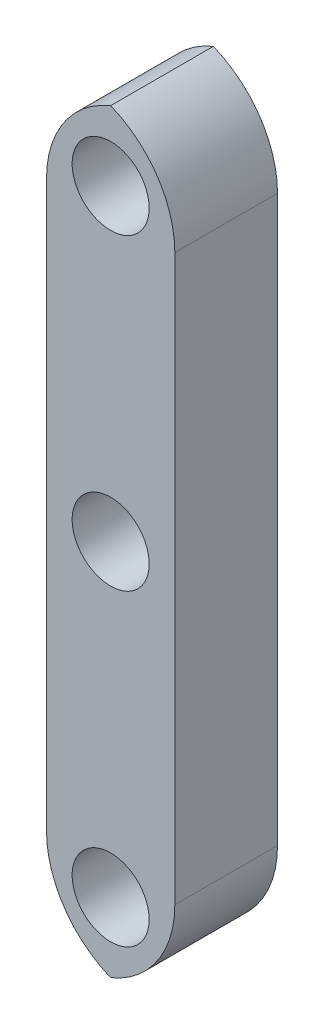
ISO-10303-21;
HEADER;
FILE_DESCRIPTION(('STEP AP214'),'2;1');
FILE_NAME('part.step','',(''),(''),'','','');
FILE_SCHEMA(('AUTOMOTIVE_DESIGN { 1 0 10303 214 1 1 1 1 }'));
ENDSEC;
DATA;
#1=APPLICATION_CONTEXT('core data for automotive mechanical design processes');
#2=APPLICATION_PROTOCOL_DEFINITION('international standard','automotive_design',2000,#1);
#3=PRODUCT_CONTEXT('',#1,'mechanical');
#4=PRODUCT('Part','Part','',(#3));
#5=PRODUCT_RELATED_PRODUCT_CATEGORY('part','',(#4));
#6=PRODUCT_DEFINITION_FORMATION('','',#4);
#7=PRODUCT_DEFINITION_CONTEXT('part definition',#1,'design');
#8=PRODUCT_DEFINITION('design','',#6,#7);
#9=PRODUCT_DEFINITION_SHAPE('','',#8);
#10=(LENGTH_UNIT() NAMED_UNIT(*) SI_UNIT(.MILLI.,.METRE.));
#11=(NAMED_UNIT(*) PLANE_ANGLE_UNIT() SI_UNIT($,.RADIAN.));
#12=(NAMED_UNIT(*) SI_UNIT($,.STERADIAN.) SOLID_ANGLE_UNIT());
#13=UNCERTAINTY_MEASURE_WITH_UNIT(LENGTH_MEASURE(1.E-05),#10,'distance_accuracy_value','');
#14=(GEOMETRIC_REPRESENTATION_CONTEXT(3) GLOBAL_UNCERTAINTY_ASSIGNED_CONTEXT((#13)) GLOBAL_UNIT_ASSIGNED_CONTEXT((#10,
#11,#12)) REPRESENTATION_CONTEXT('',''));
#15=CARTESIAN_POINT('',(0.,0.,0.));
#16=DIRECTION('',(0.,0.,1.));
#17=DIRECTION('',(1.,0.,0.));
#18=AXIS2_PLACEMENT_3D('',#15,#16,#17);
#19=CARTESIAN_POINT('',(0.,0.,5.08));
#20=DIRECTION('',(-1.,0.,0.));
#21=DIRECTION('',(0.,0.,1.));
#22=AXIS2_PLACEMENT_3D('',#19,#20,#21);
#23=PLANE('',#22);
#24=DIRECTION('',(0.,1.,0.));
#25=VECTOR('',#24,1.);
#26=CARTESIAN_POINT('',(0.,0.,0.));
#27=LINE('',#26,#25);
#28=CARTESIAN_POINT('',(0.,5.08,0.));
#29=VERTEX_POINT('',#28);
#30=CARTESIAN_POINT('',(0.,33.02,0.));
#31=VERTEX_POINT('',#30);
#32=EDGE_CURVE('E125',#29,#31,#27,.T.);
#33=ORIENTED_EDGE('',*,*,#32,.T.);
#34=DIRECTION('',(0.,0.,-1.));
#35=VECTOR('',#34,1.);
#36=CARTESIAN_POINT('',(0.,33.02,5.08));
#37=LINE('',#36,#35);
#38=CARTESIAN_POINT('',(0.,33.02,5.08));
#39=VERTEX_POINT('',#38);
#40=EDGE_CURVE('E162',#31,#39,#37,.F.);
#41=ORIENTED_EDGE('',*,*,#40,.T.);
#42=DIRECTION('',(0.,1.,0.));
#43=VECTOR('',#42,1.);
#44=CARTESIAN_POINT('',(0.,0.,5.08));
#45=LINE('',#44,#43);
#46=CARTESIAN_POINT('',(0.,5.08,5.08));
#47=VERTEX_POINT('',#46);
#48=EDGE_CURVE('E113',#47,#39,#45,.T.);
#49=ORIENTED_EDGE('',*,*,#48,.F.);
#50=DIRECTION('',(0.,0.,-1.));
#51=VECTOR('',#50,1.);
#52=CARTESIAN_POINT('',(0.,5.08,0.));
#53=LINE('',#52,#51);
#54=EDGE_CURVE('E152',#47,#29,#53,.T.);
#55=ORIENTED_EDGE('',*,*,#54,.T.);
#56=EDGE_LOOP('',(#33,#41,#49,#55));
#57=FACE_BOUND('',#56,.T.);
#58=ADVANCED_FACE('F47',(#57),#23,.F.);
#59=CARTESIAN_POINT('',(-6.35,0.,5.08));
#60=DIRECTION('',(-1.,0.,0.));
#61=DIRECTION('',(0.,0.,1.));
#62=AXIS2_PLACEMENT_3D('',#59,#60,#61);
#63=PLANE('',#62);
#64=DIRECTION('',(0.,1.,0.));
#65=VECTOR('',#64,1.);
#66=CARTESIAN_POINT('',(-6.35,0.,5.08));
#67=LINE('',#66,#65);
#68=CARTESIAN_POINT('',(-6.35,5.08,5.08));
#69=VERTEX_POINT('',#68);
#70=CARTESIAN_POINT('',(-6.35,33.02,5.08));
#71=VERTEX_POINT('',#70);
#72=EDGE_CURVE('E179',#69,#71,#67,.T.);
#73=ORIENTED_EDGE('',*,*,#72,.T.);
#74=DIRECTION('',(0.,0.,-1.));
#75=VECTOR('',#74,1.);
#76=CARTESIAN_POINT('',(-6.35,33.02,0.));
#77=LINE('',#76,#75);
#78=CARTESIAN_POINT('',(-6.35,33.02,0.));
#79=VERTEX_POINT('',#78);
#80=EDGE_CURVE('E11',#71,#79,#77,.T.);
#81=ORIENTED_EDGE('',*,*,#80,.T.);
#82=DIRECTION('',(0.,1.,0.));
#83=VECTOR('',#82,1.);
#84=CARTESIAN_POINT('',(-6.35,0.,0.));
#85=LINE('',#84,#83);
#86=CARTESIAN_POINT('',(-6.35,5.08,0.));
#87=VERTEX_POINT('',#86);
#88=EDGE_CURVE('E110',#87,#79,#85,.T.);
#89=ORIENTED_EDGE('',*,*,#88,.F.);
#90=DIRECTION('',(0.,0.,-1.));
#91=VECTOR('',#90,1.);
#92=CARTESIAN_POINT('',(-6.35,5.08,5.08));
#93=LINE('',#92,#91);
#94=EDGE_CURVE('E56',#87,#69,#93,.F.);
#95=ORIENTED_EDGE('',*,*,#94,.T.);
#96=EDGE_LOOP('',(#73,#81,#89,#95));
#97=FACE_BOUND('',#96,.T.);
#98=ADVANCED_FACE('F118',(#97),#63,.T.);
#99=CARTESIAN_POINT('',(0.,0.,5.08));
#100=DIRECTION('',(0.,0.,-1.));
#101=DIRECTION('',(-1.,0.,0.));
#102=AXIS2_PLACEMENT_3D('',#99,#100,#101);
#103=PLANE('',#102);
#104=CARTESIAN_POINT('',(-3.175,3.81,5.08));
#105=DIRECTION('',(0.,0.,1.));
#106=DIRECTION('',(1.,0.,0.));
#107=AXIS2_PLACEMENT_3D('',#104,#105,#106);
#108=CIRCLE('',#107,1.905);
#109=CARTESIAN_POINT('',(-1.27,3.81,5.08));
#110=VERTEX_POINT('',#109);
#111=EDGE_CURVE('E194',#110,#110,#108,.T.);
#112=ORIENTED_EDGE('',*,*,#111,.F.);
#113=EDGE_LOOP('',(#112));
#114=FACE_BOUND('',#113,.T.);
#115=CARTESIAN_POINT('',(-3.175,19.05,5.08));
#116=DIRECTION('',(0.,0.,1.));
#117=DIRECTION('',(1.,0.,0.));
#118=AXIS2_PLACEMENT_3D('',#115,#116,#117);
#119=CIRCLE('',#118,1.905);
#120=CARTESIAN_POINT('',(-1.27,19.05,5.08));
#121=VERTEX_POINT('',#120);
#122=EDGE_CURVE('E195',#121,#121,#119,.T.);
#123=ORIENTED_EDGE('',*,*,#122,.F.);
#124=EDGE_LOOP('',(#123));
#125=FACE_BOUND('',#124,.T.);
#126=CARTESIAN_POINT('',(-3.175,34.29,5.08));
#127=DIRECTION('',(0.,0.,1.));
#128=DIRECTION('',(1.,0.,0.));
#129=AXIS2_PLACEMENT_3D('',#126,#127,#128);
#130=CIRCLE('',#129,1.905);
#131=CARTESIAN_POINT('',(-1.27,34.29,5.08));
#132=VERTEX_POINT('',#131);
#133=EDGE_CURVE('E145',#132,#132,#130,.T.);
#134=ORIENTED_EDGE('',*,*,#133,.F.);
#135=EDGE_LOOP('',(#134));
#136=FACE_BOUND('',#135,.T.);
#137=ORIENTED_EDGE('',*,*,#48,.T.);
#138=CARTESIAN_POINT('',(-5.08,33.02,5.08));
#139=DIRECTION('',(0.,0.,-1.));
#140=DIRECTION('',(-1.,0.,0.));
#141=AXIS2_PLACEMENT_3D('',#138,#139,#140);
#142=CIRCLE('',#141,5.08);
#143=CARTESIAN_POINT('',(-3.175,37.7292860393057,5.08));
#144=VERTEX_POINT('',#143);
#145=EDGE_CURVE('E70',#39,#144,#142,.F.);
#146=ORIENTED_EDGE('',*,*,#145,.T.);
#147=CARTESIAN_POINT('',(-1.27,33.02,5.08));
#148=DIRECTION('',(0.,0.,-1.));
#149=DIRECTION('',(-1.,0.,0.));
#150=AXIS2_PLACEMENT_3D('',#147,#148,#149);
#151=CIRCLE('',#150,5.08);
#152=EDGE_CURVE('E134',#144,#71,#151,.F.);
#153=ORIENTED_EDGE('',*,*,#152,.T.);
#154=ORIENTED_EDGE('',*,*,#72,.F.);
#155=CARTESIAN_POINT('',(-1.27,5.08,5.08));
#156=DIRECTION('',(0.,0.,-1.));
#157=DIRECTION('',(-1.,0.,0.));
#158=AXIS2_PLACEMENT_3D('',#155,#156,#157);
#159=CIRCLE('',#158,5.08);
#160=CARTESIAN_POINT('',(-3.175,0.370713960694255,5.08));
#161=VERTEX_POINT('',#160);
#162=EDGE_CURVE('E74',#69,#161,#159,.F.);
#163=ORIENTED_EDGE('',*,*,#162,.T.);
#164=CARTESIAN_POINT('',(-5.08,5.08,5.08));
#165=DIRECTION('',(0.,0.,-1.));
#166=DIRECTION('',(-1.,0.,0.));
#167=AXIS2_PLACEMENT_3D('',#164,#165,#166);
#168=CIRCLE('',#167,5.08);
#169=EDGE_CURVE('E153',#161,#47,#168,.F.);
#170=ORIENTED_EDGE('',*,*,#169,.T.);
#171=EDGE_LOOP('',(#137,#146,#153,#154,#163,#170));
#172=FACE_BOUND('',#171,.T.);
#173=ADVANCED_FACE('F213',(#114,#125,#136,#172),#103,.F.);
#174=CARTESIAN_POINT('',(0.,0.,0.));
#175=DIRECTION('',(0.,0.,-1.));
#176=DIRECTION('',(-1.,0.,0.));
#177=AXIS2_PLACEMENT_3D('',#174,#175,#176);
#178=PLANE('',#177);
#179=CARTESIAN_POINT('',(-3.175,3.81,0.));
#180=DIRECTION('',(0.,0.,1.));
#181=DIRECTION('',(1.,0.,0.));
#182=AXIS2_PLACEMENT_3D('',#179,#180,#181);
#183=CIRCLE('',#182,1.905);
#184=CARTESIAN_POINT('',(-1.27,3.81,0.));
#185=VERTEX_POINT('',#184);
#186=EDGE_CURVE('E121',#185,#185,#183,.T.);
#187=ORIENTED_EDGE('',*,*,#186,.T.);
#188=EDGE_LOOP('',(#187));
#189=FACE_BOUND('',#188,.T.);
#190=CARTESIAN_POINT('',(-3.175,19.05,0.));
#191=DIRECTION('',(0.,0.,1.));
#192=DIRECTION('',(1.,0.,0.));
#193=AXIS2_PLACEMENT_3D('',#190,#191,#192);
#194=CIRCLE('',#193,1.905);
#195=CARTESIAN_POINT('',(-1.27,19.05,0.));
#196=VERTEX_POINT('',#195);
#197=EDGE_CURVE('E190',#196,#196,#194,.T.);
#198=ORIENTED_EDGE('',*,*,#197,.T.);
#199=EDGE_LOOP('',(#198));
#200=FACE_BOUND('',#199,.T.);
#201=CARTESIAN_POINT('',(-3.175,34.29,0.));
#202=DIRECTION('',(0.,0.,1.));
#203=DIRECTION('',(1.,0.,0.));
#204=AXIS2_PLACEMENT_3D('',#201,#202,#203);
#205=CIRCLE('',#204,1.905);
#206=CARTESIAN_POINT('',(-1.27,34.29,0.));
#207=VERTEX_POINT('',#206);
#208=EDGE_CURVE('E140',#207,#207,#205,.T.);
#209=ORIENTED_EDGE('',*,*,#208,.T.);
#210=EDGE_LOOP('',(#209));
#211=FACE_BOUND('',#210,.T.);
#212=CARTESIAN_POINT('',(-1.27,33.02,0.));
#213=DIRECTION('',(0.,0.,-1.));
#214=DIRECTION('',(-1.,0.,0.));
#215=AXIS2_PLACEMENT_3D('',#212,#213,#214);
#216=CIRCLE('',#215,5.08);
#217=CARTESIAN_POINT('',(-3.175,37.7292860393057,0.));
#218=VERTEX_POINT('',#217);
#219=EDGE_CURVE('E173',#79,#218,#216,.T.);
#220=ORIENTED_EDGE('',*,*,#219,.T.);
#221=CARTESIAN_POINT('',(-5.08,33.02,0.));
#222=DIRECTION('',(0.,0.,-1.));
#223=DIRECTION('',(-1.,0.,0.));
#224=AXIS2_PLACEMENT_3D('',#221,#222,#223);
#225=CIRCLE('',#224,5.08);
#226=EDGE_CURVE('E174',#218,#31,#225,.T.);
#227=ORIENTED_EDGE('',*,*,#226,.T.);
#228=ORIENTED_EDGE('',*,*,#32,.F.);
#229=CARTESIAN_POINT('',(-5.08,5.08,0.));
#230=DIRECTION('',(0.,0.,-1.));
#231=DIRECTION('',(-1.,0.,0.));
#232=AXIS2_PLACEMENT_3D('',#229,#230,#231);
#233=CIRCLE('',#232,5.08);
#234=CARTESIAN_POINT('',(-3.175,0.370713960694255,0.));
#235=VERTEX_POINT('',#234);
#236=EDGE_CURVE('E109',#29,#235,#233,.T.);
#237=ORIENTED_EDGE('',*,*,#236,.T.);
#238=CARTESIAN_POINT('',(-1.27,5.08,0.));
#239=DIRECTION('',(0.,0.,-1.));
#240=DIRECTION('',(-1.,0.,0.));
#241=AXIS2_PLACEMENT_3D('',#238,#239,#240);
#242=CIRCLE('',#241,5.08);
#243=EDGE_CURVE('E102',#235,#87,#242,.T.);
#244=ORIENTED_EDGE('',*,*,#243,.T.);
#245=ORIENTED_EDGE('',*,*,#88,.T.);
#246=EDGE_LOOP('',(#220,#227,#228,#237,#244,#245));
#247=FACE_BOUND('',#246,.T.);
#248=ADVANCED_FACE('F106',(#189,#200,#211,#247),#178,.T.);
#249=CARTESIAN_POINT('',(-3.175,34.29,0.));
#250=DIRECTION('',(0.,0.,1.));
#251=DIRECTION('',(1.,0.,0.));
#252=AXIS2_PLACEMENT_3D('',#249,#250,#251);
#253=CYLINDRICAL_SURFACE('',#252,1.905);
#254=ORIENTED_EDGE('',*,*,#208,.F.);
#255=EDGE_LOOP('',(#254));
#256=FACE_BOUND('',#255,.T.);
#257=ORIENTED_EDGE('',*,*,#133,.T.);
#258=EDGE_LOOP('',(#257));
#259=FACE_BOUND('',#258,.T.);
#260=ADVANCED_FACE('F237',(#256,#259),#253,.F.);
#261=CARTESIAN_POINT('',(-3.175,19.05,0.));
#262=DIRECTION('',(0.,0.,1.));
#263=DIRECTION('',(1.,0.,0.));
#264=AXIS2_PLACEMENT_3D('',#261,#262,#263);
#265=CYLINDRICAL_SURFACE('',#264,1.905);
#266=ORIENTED_EDGE('',*,*,#197,.F.);
#267=EDGE_LOOP('',(#266));
#268=FACE_BOUND('',#267,.T.);
#269=ORIENTED_EDGE('',*,*,#122,.T.);
#270=EDGE_LOOP('',(#269));
#271=FACE_BOUND('',#270,.T.);
#272=ADVANCED_FACE('F207',(#268,#271),#265,.F.);
#273=CARTESIAN_POINT('',(-3.175,3.81,0.));
#274=DIRECTION('',(0.,0.,1.));
#275=DIRECTION('',(1.,0.,0.));
#276=AXIS2_PLACEMENT_3D('',#273,#274,#275);
#277=CYLINDRICAL_SURFACE('',#276,1.905);
#278=ORIENTED_EDGE('',*,*,#186,.F.);
#279=EDGE_LOOP('',(#278));
#280=FACE_BOUND('',#279,.T.);
#281=ORIENTED_EDGE('',*,*,#111,.T.);
#282=EDGE_LOOP('',(#281));
#283=FACE_BOUND('',#282,.T.);
#284=ADVANCED_FACE('F202',(#280,#283),#277,.F.);
#285=CARTESIAN_POINT('',(-1.27,33.02,5.08));
#286=DIRECTION('',(0.,0.,1.));
#287=DIRECTION('',(1.,0.,0.));
#288=AXIS2_PLACEMENT_3D('',#285,#286,#287);
#289=CYLINDRICAL_SURFACE('',#288,5.08);
#290=ORIENTED_EDGE('',*,*,#80,.F.);
#291=ORIENTED_EDGE('',*,*,#152,.F.);
#292=DIRECTION('',(0.,0.,1.));
#293=VECTOR('',#292,1.);
#294=CARTESIAN_POINT('',(-3.175,37.7292860393057,2.54));
#295=LINE('',#294,#293);
#296=EDGE_CURVE('E133',#218,#144,#295,.T.);
#297=ORIENTED_EDGE('',*,*,#296,.F.);
#298=ORIENTED_EDGE('',*,*,#219,.F.);
#299=EDGE_LOOP('',(#290,#291,#297,#298));
#300=FACE_BOUND('',#299,.T.);
#301=ADVANCED_FACE('F208',(#300),#289,.T.);
#302=CARTESIAN_POINT('',(-5.08,33.02,5.08));
#303=DIRECTION('',(0.,0.,-1.));
#304=DIRECTION('',(-1.,0.,0.));
#305=AXIS2_PLACEMENT_3D('',#302,#303,#304);
#306=CYLINDRICAL_SURFACE('',#305,5.08);
#307=ORIENTED_EDGE('',*,*,#145,.F.);
#308=ORIENTED_EDGE('',*,*,#40,.F.);
#309=ORIENTED_EDGE('',*,*,#226,.F.);
#310=ORIENTED_EDGE('',*,*,#296,.T.);
#311=EDGE_LOOP('',(#307,#308,#309,#310));
#312=FACE_BOUND('',#311,.T.);
#313=ADVANCED_FACE('F225',(#312),#306,.T.);
#314=CARTESIAN_POINT('',(-1.27,5.08,5.08));
#315=DIRECTION('',(0.,0.,-1.));
#316=DIRECTION('',(-1.,0.,0.));
#317=AXIS2_PLACEMENT_3D('',#314,#315,#316);
#318=CYLINDRICAL_SURFACE('',#317,5.08);
#319=DIRECTION('',(0.,0.,-1.));
#320=VECTOR('',#319,1.);
#321=CARTESIAN_POINT('',(-3.175,0.370713960694254,2.54));
#322=LINE('',#321,#320);
#323=EDGE_CURVE('E52',#161,#235,#322,.T.);
#324=ORIENTED_EDGE('',*,*,#323,.F.);
#325=ORIENTED_EDGE('',*,*,#162,.F.);
#326=ORIENTED_EDGE('',*,*,#94,.F.);
#327=ORIENTED_EDGE('',*,*,#243,.F.);
#328=EDGE_LOOP('',(#324,#325,#326,#327));
#329=FACE_BOUND('',#328,.T.);
#330=ADVANCED_FACE('F51',(#329),#318,.T.);
#331=CARTESIAN_POINT('',(-5.08,5.08,5.08));
#332=DIRECTION('',(0.,0.,1.));
#333=DIRECTION('',(1.,0.,0.));
#334=AXIS2_PLACEMENT_3D('',#331,#332,#333);
#335=CYLINDRICAL_SURFACE('',#334,5.08);
#336=ORIENTED_EDGE('',*,*,#169,.F.);
#337=ORIENTED_EDGE('',*,*,#323,.T.);
#338=ORIENTED_EDGE('',*,*,#236,.F.);
#339=ORIENTED_EDGE('',*,*,#54,.F.);
#340=EDGE_LOOP('',(#336,#337,#338,#339));
#341=FACE_BOUND('',#340,.T.);
#342=ADVANCED_FACE('F147',(#341),#335,.T.);
#343=CLOSED_SHELL('',(#58,#98,#173,#248,#260,#272,#284,#301,#313,#330,#342));
#344=MANIFOLD_SOLID_BREP('B2',#343);
#345=ADVANCED_BREP_SHAPE_REPRESENTATION('',(#18,#344),#14);
#346=SHAPE_DEFINITION_REPRESENTATION(#9,#345);
ENDSEC;
END-ISO-10303-21;
